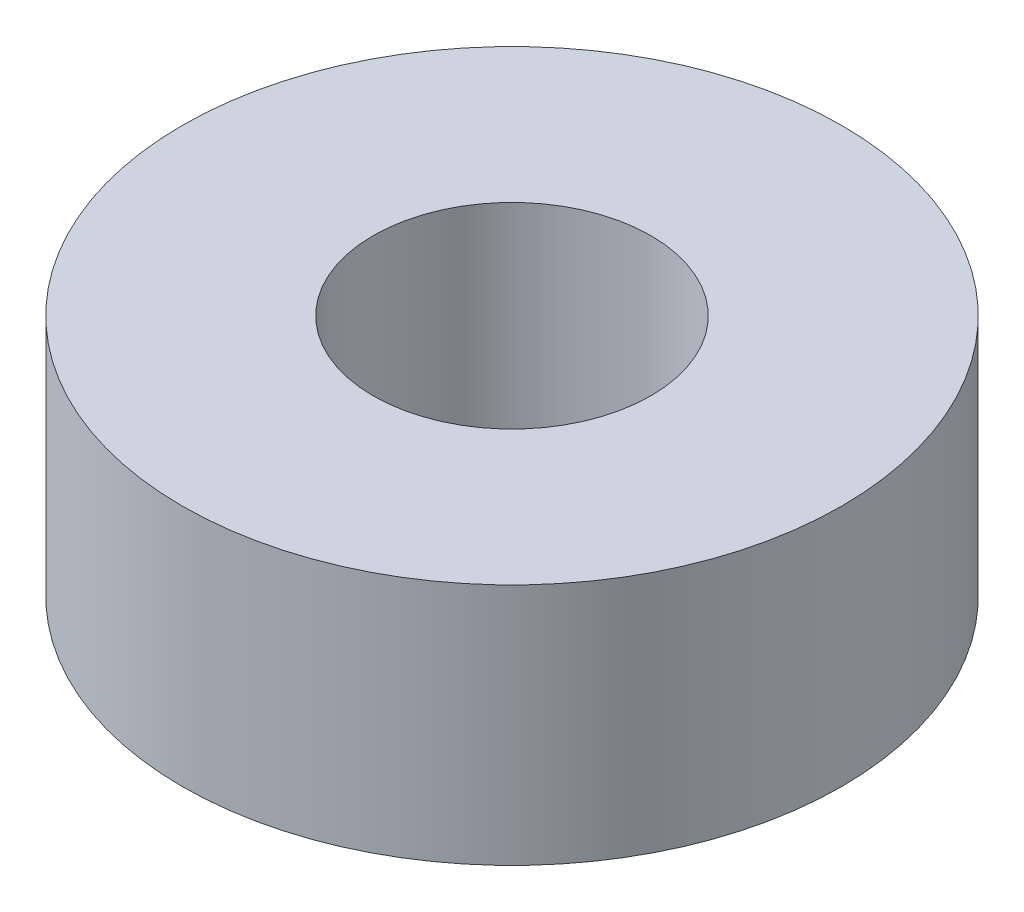
ISO-10303-21;
HEADER;
FILE_DESCRIPTION(('STEP AP214'),'2;1');
FILE_NAME('part.step','',(''),(''),'','','');
FILE_SCHEMA(('AUTOMOTIVE_DESIGN { 1 0 10303 214 1 1 1 1 }'));
ENDSEC;
DATA;
#1=APPLICATION_CONTEXT('core data for automotive mechanical design processes');
#2=APPLICATION_PROTOCOL_DEFINITION('international standard','automotive_design',2000,#1);
#3=PRODUCT_CONTEXT('',#1,'mechanical');
#4=PRODUCT('Part','Part','',(#3));
#5=PRODUCT_RELATED_PRODUCT_CATEGORY('part','',(#4));
#6=PRODUCT_DEFINITION_FORMATION('','',#4);
#7=PRODUCT_DEFINITION_CONTEXT('part definition',#1,'design');
#8=PRODUCT_DEFINITION('design','',#6,#7);
#9=PRODUCT_DEFINITION_SHAPE('','',#8);
#10=(LENGTH_UNIT() NAMED_UNIT(*) SI_UNIT(.MILLI.,.METRE.));
#11=(NAMED_UNIT(*) PLANE_ANGLE_UNIT() SI_UNIT($,.RADIAN.));
#12=(NAMED_UNIT(*) SI_UNIT($,.STERADIAN.) SOLID_ANGLE_UNIT());
#13=UNCERTAINTY_MEASURE_WITH_UNIT(LENGTH_MEASURE(1.E-05),#10,'distance_accuracy_value','');
#14=(GEOMETRIC_REPRESENTATION_CONTEXT(3) GLOBAL_UNCERTAINTY_ASSIGNED_CONTEXT((#13)) GLOBAL_UNIT_ASSIGNED_CONTEXT((#10,
#11,#12)) REPRESENTATION_CONTEXT('',''));
#15=CARTESIAN_POINT('',(0.,0.,0.));
#16=DIRECTION('',(0.,0.,1.));
#17=DIRECTION('',(1.,0.,0.));
#18=AXIS2_PLACEMENT_3D('',#15,#16,#17);
#19=CARTESIAN_POINT('',(0.,7.,0.));
#20=DIRECTION('',(0.,1.,0.));
#21=DIRECTION('',(0.,0.,1.));
#22=AXIS2_PLACEMENT_3D('',#19,#20,#21);
#23=PLANE('',#22);
#24=CARTESIAN_POINT('',(0.,7.,0.));
#25=DIRECTION('',(0.,1.,0.));
#26=DIRECTION('',(0.,0.,1.));
#27=AXIS2_PLACEMENT_3D('',#24,#25,#26);
#28=CIRCLE('',#27,9.5);
#29=CARTESIAN_POINT('',(0.,7.,9.5));
#30=VERTEX_POINT('',#29);
#31=EDGE_CURVE('E10',#30,#30,#28,.T.);
#32=ORIENTED_EDGE('',*,*,#31,.T.);
#33=EDGE_LOOP('',(#32));
#34=FACE_BOUND('',#33,.T.);
#35=CARTESIAN_POINT('',(0.,7.,0.));
#36=DIRECTION('',(0.,1.,0.));
#37=DIRECTION('',(0.,0.,1.));
#38=AXIS2_PLACEMENT_3D('',#35,#36,#37);
#39=CIRCLE('',#38,4.);
#40=CARTESIAN_POINT('',(0.,7.,4.));
#41=VERTEX_POINT('',#40);
#42=EDGE_CURVE('E48',#41,#41,#39,.T.);
#43=ORIENTED_EDGE('',*,*,#42,.F.);
#44=EDGE_LOOP('',(#43));
#45=FACE_BOUND('',#44,.T.);
#46=ADVANCED_FACE('F37',(#34,#45),#23,.T.);
#47=CARTESIAN_POINT('',(0.,0.,0.));
#48=DIRECTION('',(0.,1.,0.));
#49=DIRECTION('',(0.,0.,1.));
#50=AXIS2_PLACEMENT_3D('',#47,#48,#49);
#51=PLANE('',#50);
#52=CARTESIAN_POINT('',(0.,0.,0.));
#53=DIRECTION('',(0.,1.,0.));
#54=DIRECTION('',(0.,0.,1.));
#55=AXIS2_PLACEMENT_3D('',#52,#53,#54);
#56=CIRCLE('',#55,9.5);
#57=CARTESIAN_POINT('',(0.,0.,9.5));
#58=VERTEX_POINT('',#57);
#59=EDGE_CURVE('E41',#58,#58,#56,.T.);
#60=ORIENTED_EDGE('',*,*,#59,.F.);
#61=EDGE_LOOP('',(#60));
#62=FACE_BOUND('',#61,.T.);
#63=CARTESIAN_POINT('',(0.,0.,0.));
#64=DIRECTION('',(0.,1.,0.));
#65=DIRECTION('',(0.,0.,1.));
#66=AXIS2_PLACEMENT_3D('',#63,#64,#65);
#67=CIRCLE('',#66,4.);
#68=CARTESIAN_POINT('',(0.,0.,4.));
#69=VERTEX_POINT('',#68);
#70=EDGE_CURVE('E50',#69,#69,#67,.T.);
#71=ORIENTED_EDGE('',*,*,#70,.T.);
#72=EDGE_LOOP('',(#71));
#73=FACE_BOUND('',#72,.T.);
#74=ADVANCED_FACE('F60',(#62,#73),#51,.F.);
#75=CARTESIAN_POINT('',(0.,7.,0.));
#76=DIRECTION('',(0.,-1.,0.));
#77=DIRECTION('',(0.,0.,-1.));
#78=AXIS2_PLACEMENT_3D('',#75,#76,#77);
#79=CYLINDRICAL_SURFACE('',#78,9.5);
#80=ORIENTED_EDGE('',*,*,#31,.F.);
#81=EDGE_LOOP('',(#80));
#82=FACE_BOUND('',#81,.T.);
#83=ORIENTED_EDGE('',*,*,#59,.T.);
#84=EDGE_LOOP('',(#83));
#85=FACE_BOUND('',#84,.T.);
#86=ADVANCED_FACE('F39',(#82,#85),#79,.T.);
#87=CARTESIAN_POINT('',(0.,7.,0.));
#88=DIRECTION('',(0.,-1.,0.));
#89=DIRECTION('',(0.,0.,-1.));
#90=AXIS2_PLACEMENT_3D('',#87,#88,#89);
#91=CYLINDRICAL_SURFACE('',#90,4.);
#92=ORIENTED_EDGE('',*,*,#42,.T.);
#93=EDGE_LOOP('',(#92));
#94=FACE_BOUND('',#93,.T.);
#95=ORIENTED_EDGE('',*,*,#70,.F.);
#96=EDGE_LOOP('',(#95));
#97=FACE_BOUND('',#96,.T.);
#98=ADVANCED_FACE('F56',(#94,#97),#91,.F.);
#99=CLOSED_SHELL('',(#46,#74,#86,#98));
#100=MANIFOLD_SOLID_BREP('B2',#99);
#101=ADVANCED_BREP_SHAPE_REPRESENTATION('',(#18,#100),#14);
#102=SHAPE_DEFINITION_REPRESENTATION(#9,#101);
ENDSEC;
END-ISO-10303-21;
